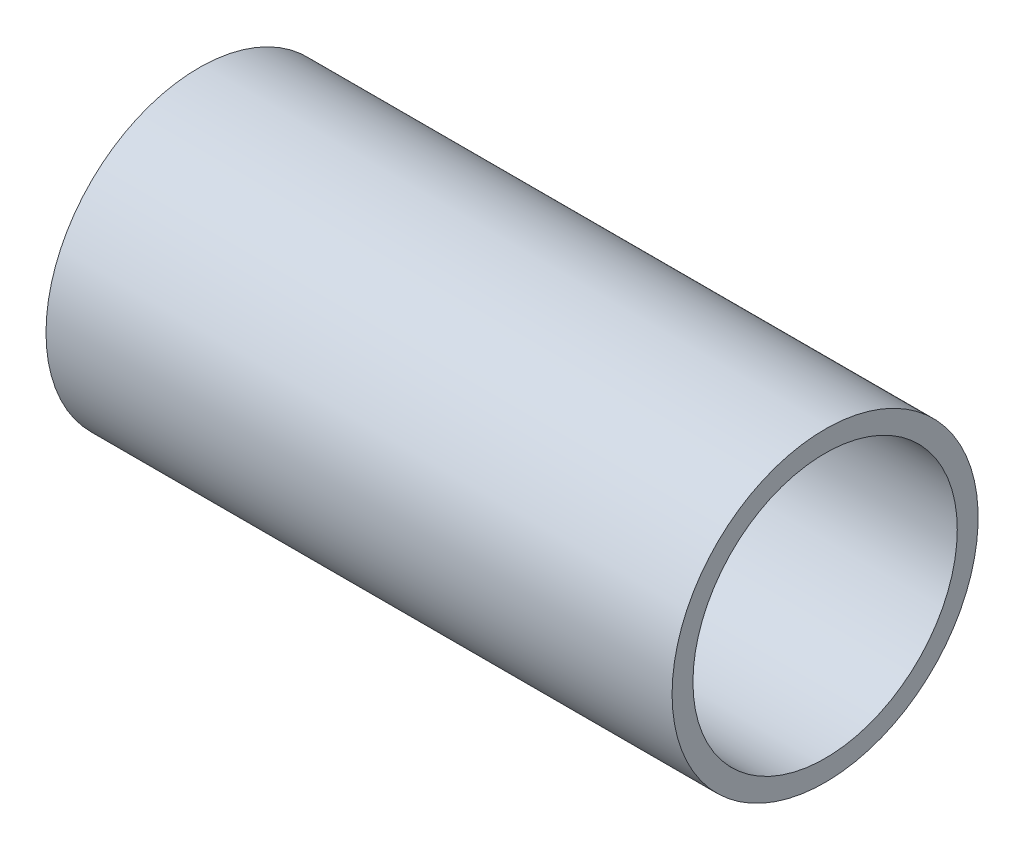
ISO-10303-21;
HEADER;
FILE_DESCRIPTION(('STEP AP214'),'2;1');
FILE_NAME('part.step','',(''),(''),'','','');
FILE_SCHEMA(('AUTOMOTIVE_DESIGN { 1 0 10303 214 1 1 1 1 }'));
ENDSEC;
DATA;
#1=APPLICATION_CONTEXT('core data for automotive mechanical design processes');
#2=APPLICATION_PROTOCOL_DEFINITION('international standard','automotive_design',2000,#1);
#3=PRODUCT_CONTEXT('',#1,'mechanical');
#4=PRODUCT('Part','Part','',(#3));
#5=PRODUCT_RELATED_PRODUCT_CATEGORY('part','',(#4));
#6=PRODUCT_DEFINITION_FORMATION('','',#4);
#7=PRODUCT_DEFINITION_CONTEXT('part definition',#1,'design');
#8=PRODUCT_DEFINITION('design','',#6,#7);
#9=PRODUCT_DEFINITION_SHAPE('','',#8);
#10=(LENGTH_UNIT() NAMED_UNIT(*) SI_UNIT(.MILLI.,.METRE.));
#11=(NAMED_UNIT(*) PLANE_ANGLE_UNIT() SI_UNIT($,.RADIAN.));
#12=(NAMED_UNIT(*) SI_UNIT($,.STERADIAN.) SOLID_ANGLE_UNIT());
#13=UNCERTAINTY_MEASURE_WITH_UNIT(LENGTH_MEASURE(1.E-05),#10,'distance_accuracy_value','');
#14=(GEOMETRIC_REPRESENTATION_CONTEXT(3) GLOBAL_UNCERTAINTY_ASSIGNED_CONTEXT((#13)) GLOBAL_UNIT_ASSIGNED_CONTEXT((#10,
#11,#12)) REPRESENTATION_CONTEXT('',''));
#15=CARTESIAN_POINT('',(0.,0.,0.));
#16=DIRECTION('',(0.,0.,1.));
#17=DIRECTION('',(1.,0.,0.));
#18=AXIS2_PLACEMENT_3D('',#15,#16,#17);
#19=CARTESIAN_POINT('',(45.,0.,0.));
#20=DIRECTION('',(1.,0.,0.));
#21=DIRECTION('',(0.,0.,-1.));
#22=AXIS2_PLACEMENT_3D('',#19,#20,#21);
#23=PLANE('',#22);
#24=CARTESIAN_POINT('',(45.,0.,0.));
#25=DIRECTION('',(1.,0.,0.));
#26=DIRECTION('',(0.,0.,-1.));
#27=AXIS2_PLACEMENT_3D('',#24,#25,#26);
#28=CIRCLE('',#27,11.);
#29=CARTESIAN_POINT('',(45.,0.,11.));
#30=VERTEX_POINT('',#29);
#31=EDGE_CURVE('E10',#30,#30,#28,.T.);
#32=ORIENTED_EDGE('',*,*,#31,.T.);
#33=EDGE_LOOP('',(#32));
#34=FACE_BOUND('',#33,.T.);
#35=CARTESIAN_POINT('',(45.,0.,0.));
#36=DIRECTION('',(1.,0.,0.));
#37=DIRECTION('',(0.,0.,-1.));
#38=AXIS2_PLACEMENT_3D('',#35,#36,#37);
#39=CIRCLE('',#38,9.5);
#40=CARTESIAN_POINT('',(45.,0.,9.5));
#41=VERTEX_POINT('',#40);
#42=EDGE_CURVE('E42',#41,#41,#39,.T.);
#43=ORIENTED_EDGE('',*,*,#42,.F.);
#44=EDGE_LOOP('',(#43));
#45=FACE_BOUND('',#44,.T.);
#46=ADVANCED_FACE('F31',(#34,#45),#23,.T.);
#47=CARTESIAN_POINT('',(0.,0.,0.));
#48=DIRECTION('',(1.,0.,0.));
#49=DIRECTION('',(0.,0.,-1.));
#50=AXIS2_PLACEMENT_3D('',#47,#48,#49);
#51=PLANE('',#50);
#52=CARTESIAN_POINT('',(0.,0.,0.));
#53=DIRECTION('',(1.,0.,0.));
#54=DIRECTION('',(0.,0.,-1.));
#55=AXIS2_PLACEMENT_3D('',#52,#53,#54);
#56=CIRCLE('',#55,11.);
#57=CARTESIAN_POINT('',(0.,0.,11.));
#58=VERTEX_POINT('',#57);
#59=EDGE_CURVE('E35',#58,#58,#56,.T.);
#60=ORIENTED_EDGE('',*,*,#59,.F.);
#61=EDGE_LOOP('',(#60));
#62=FACE_BOUND('',#61,.T.);
#63=CARTESIAN_POINT('',(0.,0.,0.));
#64=DIRECTION('',(1.,0.,0.));
#65=DIRECTION('',(0.,0.,-1.));
#66=AXIS2_PLACEMENT_3D('',#63,#64,#65);
#67=CIRCLE('',#66,9.5);
#68=CARTESIAN_POINT('',(0.,0.,9.5));
#69=VERTEX_POINT('',#68);
#70=EDGE_CURVE('E44',#69,#69,#67,.T.);
#71=ORIENTED_EDGE('',*,*,#70,.T.);
#72=EDGE_LOOP('',(#71));
#73=FACE_BOUND('',#72,.T.);
#74=ADVANCED_FACE('F54',(#62,#73),#51,.F.);
#75=CARTESIAN_POINT('',(45.,0.,0.));
#76=DIRECTION('',(-1.,0.,0.));
#77=DIRECTION('',(0.,0.,1.));
#78=AXIS2_PLACEMENT_3D('',#75,#76,#77);
#79=CYLINDRICAL_SURFACE('',#78,11.);
#80=CARTESIAN_POINT('',(45.,0.,11.));
#81=CARTESIAN_POINT('',(44.53125,0.,11.));
#82=CARTESIAN_POINT('',(44.0625,0.,11.));
#83=CARTESIAN_POINT('',(43.125,0.,11.));
#84=CARTESIAN_POINT('',(42.65625,0.,11.));
#85=CARTESIAN_POINT('',(41.71875,0.,11.));
#86=CARTESIAN_POINT('',(41.25,0.,11.));
#87=CARTESIAN_POINT('',(40.3125,0.,11.));
#88=CARTESIAN_POINT('',(39.84375,0.,11.));
#89=CARTESIAN_POINT('',(38.90625,0.,11.));
#90=CARTESIAN_POINT('',(38.4375,0.,11.));
#91=CARTESIAN_POINT('',(37.5,0.,11.));
#92=CARTESIAN_POINT('',(37.03125,0.,11.));
#93=CARTESIAN_POINT('',(36.09375,0.,11.));
#94=CARTESIAN_POINT('',(35.625,0.,11.));
#95=CARTESIAN_POINT('',(34.6875,0.,11.));
#96=CARTESIAN_POINT('',(34.21875,0.,11.));
#97=CARTESIAN_POINT('',(33.28125,0.,11.));
#98=CARTESIAN_POINT('',(32.8125,0.,11.));
#99=CARTESIAN_POINT('',(31.875,0.,11.));
#100=CARTESIAN_POINT('',(31.40625,0.,11.));
#101=CARTESIAN_POINT('',(30.46875,0.,11.));
#102=CARTESIAN_POINT('',(30.,0.,11.));
#103=CARTESIAN_POINT('',(29.0625,0.,11.));
#104=CARTESIAN_POINT('',(28.59375,0.,11.));
#105=CARTESIAN_POINT('',(27.65625,0.,11.));
#106=CARTESIAN_POINT('',(27.1875,0.,11.));
#107=CARTESIAN_POINT('',(26.25,0.,11.));
#108=CARTESIAN_POINT('',(25.78125,0.,11.));
#109=CARTESIAN_POINT('',(24.84375,0.,11.));
#110=CARTESIAN_POINT('',(24.375,0.,11.));
#111=CARTESIAN_POINT('',(23.4375,0.,11.));
#112=CARTESIAN_POINT('',(22.96875,0.,11.));
#113=CARTESIAN_POINT('',(22.03125,0.,11.));
#114=CARTESIAN_POINT('',(21.5625,0.,11.));
#115=CARTESIAN_POINT('',(20.625,0.,11.));
#116=CARTESIAN_POINT('',(20.15625,0.,11.));
#117=CARTESIAN_POINT('',(19.21875,0.,11.));
#118=CARTESIAN_POINT('',(18.75,0.,11.));
#119=CARTESIAN_POINT('',(17.8125,0.,11.));
#120=CARTESIAN_POINT('',(17.34375,0.,11.));
#121=CARTESIAN_POINT('',(16.40625,0.,11.));
#122=CARTESIAN_POINT('',(15.9375,0.,11.));
#123=CARTESIAN_POINT('',(15.,0.,11.));
#124=CARTESIAN_POINT('',(14.53125,0.,11.));
#125=CARTESIAN_POINT('',(13.59375,0.,11.));
#126=CARTESIAN_POINT('',(13.125,0.,11.));
#127=CARTESIAN_POINT('',(12.1875,0.,11.));
#128=CARTESIAN_POINT('',(11.71875,0.,11.));
#129=CARTESIAN_POINT('',(10.78125,0.,11.));
#130=CARTESIAN_POINT('',(10.3125,0.,11.));
#131=CARTESIAN_POINT('',(9.375,0.,11.));
#132=CARTESIAN_POINT('',(8.90625,0.,11.));
#133=CARTESIAN_POINT('',(7.96874999999999,0.,11.));
#134=CARTESIAN_POINT('',(7.5,0.,11.));
#135=CARTESIAN_POINT('',(6.5625,0.,11.));
#136=CARTESIAN_POINT('',(6.09375,0.,11.));
#137=CARTESIAN_POINT('',(5.15625,0.,11.));
#138=CARTESIAN_POINT('',(4.68749999999999,0.,11.));
#139=CARTESIAN_POINT('',(3.74999999999999,0.,11.));
#140=CARTESIAN_POINT('',(3.28124999999999,0.,11.));
#141=CARTESIAN_POINT('',(2.34374999999999,0.,11.));
#142=CARTESIAN_POINT('',(1.87499999999999,0.,11.));
#143=CARTESIAN_POINT('',(0.937499999999992,0.,11.));
#144=CARTESIAN_POINT('',(0.468749999999993,0.,11.));
#145=CARTESIAN_POINT('',(0.,0.,11.));
#146=B_SPLINE_CURVE_WITH_KNOTS('',3,(#80,#81,#82,#83,#84,#85,#86,#87,#88,#89,#90,#91,#92,#93,
#94,#95,#96,#97,#98,#99,#100,#101,#102,#103,#104,#105,#106,#107,#108,#109,#110,#111,#112,#113,
#114,#115,#116,#117,#118,#119,#120,#121,#122,#123,#124,#125,#126,#127,#128,#129,#130,#131,#132,
#133,#134,#135,#136,#137,#138,#139,#140,#141,#142,#143,#144,#145),.UNSPECIFIED.,.F.,.F.,(4,2,2,
2,2,2,2,2,2,2,2,2,2,2,2,2,2,2,2,2,2,2,2,2,2,2,2,2,2,2,2,2,4),(0.,1.40625,2.8125,
4.21875000000001,5.62500000000001,7.03125,8.4375,9.84375000000001,11.25,12.65625,14.0625,
15.46875,16.875,18.28125,19.6875,21.09375,22.5,23.90625,25.3125,26.71875,28.125,29.53125,
30.9375,32.34375,33.75,35.15625,36.5625,37.96875,39.375,40.78125,42.1875,43.59375,45.),.UNSPECIFIED.);
#147=EDGE_CURVE('BSEAM33',#30,#58,#146,.T.);
#148=ORIENTED_EDGE('',*,*,#31,.F.);
#149=ORIENTED_EDGE('',*,*,#59,.T.);
#150=ORIENTED_EDGE('',*,*,#147,.T.);
#151=ORIENTED_EDGE('',*,*,#147,.F.);
#152=EDGE_LOOP('',(#148,#150,#149,#151));
#153=FACE_BOUND('',#152,.T.);
#154=ADVANCED_FACE('F33',(#153),#79,.T.);
#155=CARTESIAN_POINT('',(45.,0.,0.));
#156=DIRECTION('',(-1.,0.,0.));
#157=DIRECTION('',(0.,0.,1.));
#158=AXIS2_PLACEMENT_3D('',#155,#156,#157);
#159=CYLINDRICAL_SURFACE('',#158,9.5);
#160=CARTESIAN_POINT('',(45.,0.,9.5));
#161=CARTESIAN_POINT('',(44.53125,0.,9.5));
#162=CARTESIAN_POINT('',(44.0625,0.,9.5));
#163=CARTESIAN_POINT('',(43.125,0.,9.5));
#164=CARTESIAN_POINT('',(42.65625,0.,9.5));
#165=CARTESIAN_POINT('',(41.71875,0.,9.5));
#166=CARTESIAN_POINT('',(41.25,0.,9.5));
#167=CARTESIAN_POINT('',(40.3125,0.,9.5));
#168=CARTESIAN_POINT('',(39.84375,0.,9.5));
#169=CARTESIAN_POINT('',(38.90625,0.,9.5));
#170=CARTESIAN_POINT('',(38.4375,0.,9.5));
#171=CARTESIAN_POINT('',(37.5,0.,9.5));
#172=CARTESIAN_POINT('',(37.03125,0.,9.5));
#173=CARTESIAN_POINT('',(36.09375,0.,9.5));
#174=CARTESIAN_POINT('',(35.625,0.,9.5));
#175=CARTESIAN_POINT('',(34.6875,0.,9.5));
#176=CARTESIAN_POINT('',(34.21875,0.,9.5));
#177=CARTESIAN_POINT('',(33.28125,0.,9.5));
#178=CARTESIAN_POINT('',(32.8125,0.,9.5));
#179=CARTESIAN_POINT('',(31.875,0.,9.5));
#180=CARTESIAN_POINT('',(31.40625,0.,9.5));
#181=CARTESIAN_POINT('',(30.46875,0.,9.5));
#182=CARTESIAN_POINT('',(30.,0.,9.5));
#183=CARTESIAN_POINT('',(29.0625,0.,9.5));
#184=CARTESIAN_POINT('',(28.59375,0.,9.5));
#185=CARTESIAN_POINT('',(27.65625,0.,9.5));
#186=CARTESIAN_POINT('',(27.1875,0.,9.5));
#187=CARTESIAN_POINT('',(26.25,0.,9.5));
#188=CARTESIAN_POINT('',(25.78125,0.,9.5));
#189=CARTESIAN_POINT('',(24.84375,0.,9.5));
#190=CARTESIAN_POINT('',(24.375,0.,9.5));
#191=CARTESIAN_POINT('',(23.4375,0.,9.5));
#192=CARTESIAN_POINT('',(22.96875,0.,9.5));
#193=CARTESIAN_POINT('',(22.03125,0.,9.5));
#194=CARTESIAN_POINT('',(21.5625,0.,9.5));
#195=CARTESIAN_POINT('',(20.625,0.,9.5));
#196=CARTESIAN_POINT('',(20.15625,0.,9.5));
#197=CARTESIAN_POINT('',(19.21875,0.,9.5));
#198=CARTESIAN_POINT('',(18.75,0.,9.5));
#199=CARTESIAN_POINT('',(17.8125,0.,9.5));
#200=CARTESIAN_POINT('',(17.34375,0.,9.5));
#201=CARTESIAN_POINT('',(16.40625,0.,9.5));
#202=CARTESIAN_POINT('',(15.9375,0.,9.5));
#203=CARTESIAN_POINT('',(15.,0.,9.5));
#204=CARTESIAN_POINT('',(14.53125,0.,9.5));
#205=CARTESIAN_POINT('',(13.59375,0.,9.5));
#206=CARTESIAN_POINT('',(13.125,0.,9.5));
#207=CARTESIAN_POINT('',(12.1875,0.,9.5));
#208=CARTESIAN_POINT('',(11.71875,0.,9.5));
#209=CARTESIAN_POINT('',(10.78125,0.,9.5));
#210=CARTESIAN_POINT('',(10.3125,0.,9.5));
#211=CARTESIAN_POINT('',(9.37499999999999,0.,9.5));
#212=CARTESIAN_POINT('',(8.90624999999999,0.,9.5));
#213=CARTESIAN_POINT('',(7.96874999999999,0.,9.5));
#214=CARTESIAN_POINT('',(7.5,0.,9.5));
#215=CARTESIAN_POINT('',(6.56249999999999,0.,9.5));
#216=CARTESIAN_POINT('',(6.09374999999999,0.,9.5));
#217=CARTESIAN_POINT('',(5.15624999999999,0.,9.5));
#218=CARTESIAN_POINT('',(4.68749999999999,0.,9.5));
#219=CARTESIAN_POINT('',(3.74999999999999,0.,9.5));
#220=CARTESIAN_POINT('',(3.28124999999999,0.,9.5));
#221=CARTESIAN_POINT('',(2.34374999999999,0.,9.5));
#222=CARTESIAN_POINT('',(1.87499999999999,0.,9.5));
#223=CARTESIAN_POINT('',(0.937499999999992,0.,9.5));
#224=CARTESIAN_POINT('',(0.468749999999993,0.,9.5));
#225=CARTESIAN_POINT('',(0.,0.,9.5));
#226=B_SPLINE_CURVE_WITH_KNOTS('',3,(#160,#161,#162,#163,#164,#165,#166,#167,#168,#169,#170,
#171,#172,#173,#174,#175,#176,#177,#178,#179,#180,#181,#182,#183,#184,#185,#186,#187,#188,#189,
#190,#191,#192,#193,#194,#195,#196,#197,#198,#199,#200,#201,#202,#203,#204,#205,#206,#207,#208,
#209,#210,#211,#212,#213,#214,#215,#216,#217,#218,#219,#220,#221,#222,#223,#224,#225),
.UNSPECIFIED.,.F.,.F.,(4,2,2,2,2,2,2,2,2,2,2,2,2,2,2,2,2,2,2,2,2,2,2,2,2,2,2,2,2,2,2,2,4),(0.,
1.40625,2.8125,4.21874999999999,5.625,7.03125,8.43749999999999,9.84375,11.25,12.65625,14.0625,
15.46875,16.875,18.28125,19.6875,21.09375,22.5,23.90625,25.3125,26.71875,28.125,29.53125,
30.9375,32.34375,33.75,35.15625,36.5625,37.96875,39.375,40.78125,42.1875,43.59375,45.),.UNSPECIFIED.);
#227=EDGE_CURVE('BSEAM50',#41,#69,#226,.T.);
#228=ORIENTED_EDGE('',*,*,#42,.T.);
#229=ORIENTED_EDGE('',*,*,#70,.F.);
#230=ORIENTED_EDGE('',*,*,#227,.T.);
#231=ORIENTED_EDGE('',*,*,#227,.F.);
#232=EDGE_LOOP('',(#228,#230,#229,#231));
#233=FACE_BOUND('',#232,.T.);
#234=ADVANCED_FACE('F50',(#233),#159,.F.);
#235=CLOSED_SHELL('',(#46,#74,#154,#234));
#236=MANIFOLD_SOLID_BREP('B2',#235);
#237=ADVANCED_BREP_SHAPE_REPRESENTATION('',(#18,#236),#14);
#238=SHAPE_DEFINITION_REPRESENTATION(#9,#237);
ENDSEC;
END-ISO-10303-21;
